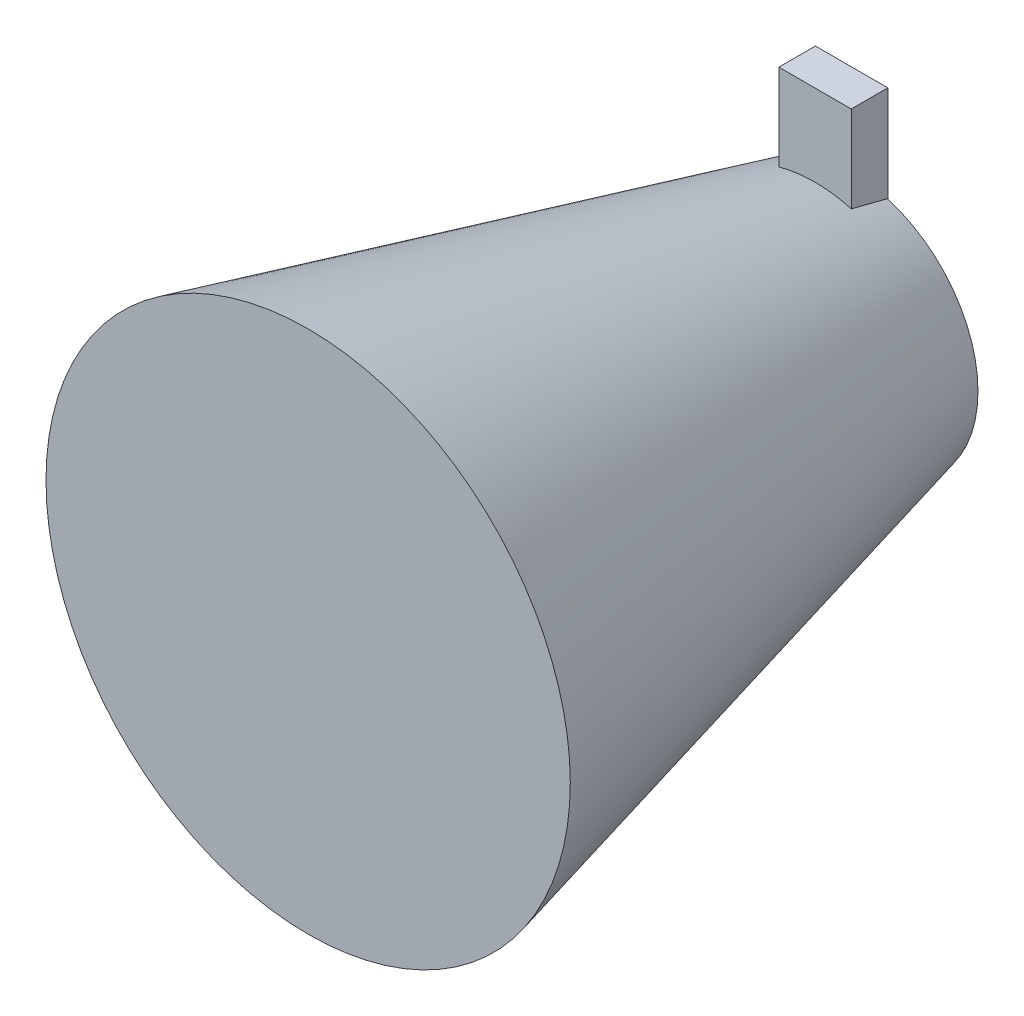
ISO-10303-21;
HEADER;
FILE_DESCRIPTION(('STEP AP214'),'2;1');
FILE_NAME('part.step','',(''),(''),'','','');
FILE_SCHEMA(('AUTOMOTIVE_DESIGN { 1 0 10303 214 1 1 1 1 }'));
ENDSEC;
DATA;
#1=APPLICATION_CONTEXT('core data for automotive mechanical design processes');
#2=APPLICATION_PROTOCOL_DEFINITION('international standard','automotive_design',2000,#1);
#3=PRODUCT_CONTEXT('',#1,'mechanical');
#4=PRODUCT('Part','Part','',(#3));
#5=PRODUCT_RELATED_PRODUCT_CATEGORY('part','',(#4));
#6=PRODUCT_DEFINITION_FORMATION('','',#4);
#7=PRODUCT_DEFINITION_CONTEXT('part definition',#1,'design');
#8=PRODUCT_DEFINITION('design','',#6,#7);
#9=PRODUCT_DEFINITION_SHAPE('','',#8);
#10=(LENGTH_UNIT() NAMED_UNIT(*) SI_UNIT(.MILLI.,.METRE.));
#11=(NAMED_UNIT(*) PLANE_ANGLE_UNIT() SI_UNIT($,.RADIAN.));
#12=(NAMED_UNIT(*) SI_UNIT($,.STERADIAN.) SOLID_ANGLE_UNIT());
#13=UNCERTAINTY_MEASURE_WITH_UNIT(LENGTH_MEASURE(1.E-05),#10,'distance_accuracy_value','');
#14=(GEOMETRIC_REPRESENTATION_CONTEXT(3) GLOBAL_UNCERTAINTY_ASSIGNED_CONTEXT((#13)) GLOBAL_UNIT_ASSIGNED_CONTEXT((#10,
#11,#12)) REPRESENTATION_CONTEXT('',''));
#15=CARTESIAN_POINT('',(0.,0.,0.));
#16=DIRECTION('',(0.,0.,1.));
#17=DIRECTION('',(1.,0.,0.));
#18=AXIS2_PLACEMENT_3D('',#15,#16,#17);
#19=CARTESIAN_POINT('',(-44.6455473550552,34.7888658367911,1.));
#20=DIRECTION('',(1.,0.,0.));
#21=DIRECTION('',(0.,0.,-1.));
#22=AXIS2_PLACEMENT_3D('',#19,#20,#21);
#23=PLANE('',#22);
#24=DIRECTION('',(0.,0.,-1.));
#25=VECTOR('',#24,1.);
#26=CARTESIAN_POINT('',(-44.6455473550552,34.7888658367911,1.));
#27=LINE('',#26,#25);
#28=CARTESIAN_POINT('',(-44.6455473550552,34.7888658367911,1.));
#29=VERTEX_POINT('',#28);
#30=CARTESIAN_POINT('',(-44.6455473550552,34.7888658367911,-0.01));
#31=VERTEX_POINT('',#30);
#32=EDGE_CURVE('E44',#29,#31,#27,.T.);
#33=ORIENTED_EDGE('',*,*,#32,.T.);
#34=DIRECTION('',(0.,-1.,0.));
#35=VECTOR('',#34,1.);
#36=CARTESIAN_POINT('',(-44.6455473550552,34.7888658367911,-0.01));
#37=LINE('',#36,#35);
#38=CARTESIAN_POINT('',(-44.6455473550552,40.7888658367911,-0.01));
#39=VERTEX_POINT('',#38);
#40=EDGE_CURVE('E81',#39,#31,#37,.T.);
#41=ORIENTED_EDGE('',*,*,#40,.F.);
#42=DIRECTION('',(0.,0.,-1.));
#43=VECTOR('',#42,1.);
#44=CARTESIAN_POINT('',(-44.6455473550552,40.7888658367911,1.));
#45=LINE('',#44,#43);
#46=CARTESIAN_POINT('',(-44.6455473550552,40.7888658367911,1.));
#47=VERTEX_POINT('',#46);
#48=EDGE_CURVE('E12',#47,#39,#45,.T.);
#49=ORIENTED_EDGE('',*,*,#48,.F.);
#50=DIRECTION('',(0.,-1.,0.));
#51=VECTOR('',#50,1.);
#52=CARTESIAN_POINT('',(-44.6455473550552,34.7888658367911,1.));
#53=LINE('',#52,#51);
#54=EDGE_CURVE('E82',#47,#29,#53,.T.);
#55=ORIENTED_EDGE('',*,*,#54,.T.);
#56=EDGE_LOOP('',(#33,#41,#49,#55));
#57=FACE_BOUND('',#56,.T.);
#58=ADVANCED_FACE('F41',(#57),#23,.T.);
#59=CARTESIAN_POINT('',(-44.6455473550552,40.7888658367911,1.));
#60=DIRECTION('',(0.,1.,0.));
#61=DIRECTION('',(0.,0.,1.));
#62=AXIS2_PLACEMENT_3D('',#59,#60,#61);
#63=PLANE('',#62);
#64=ORIENTED_EDGE('',*,*,#48,.T.);
#65=DIRECTION('',(1.,0.,0.));
#66=VECTOR('',#65,1.);
#67=CARTESIAN_POINT('',(-44.6455473550552,40.7888658367911,-0.01));
#68=LINE('',#67,#66);
#69=CARTESIAN_POINT('',(-46.6455473550552,40.7888658367911,-0.01));
#70=VERTEX_POINT('',#69);
#71=EDGE_CURVE('E98',#70,#39,#68,.T.);
#72=ORIENTED_EDGE('',*,*,#71,.F.);
#73=DIRECTION('',(0.,0.,-1.));
#74=VECTOR('',#73,1.);
#75=CARTESIAN_POINT('',(-46.6455473550552,40.7888658367911,1.));
#76=LINE('',#75,#74);
#77=CARTESIAN_POINT('',(-46.6455473550552,40.7888658367911,1.));
#78=VERTEX_POINT('',#77);
#79=EDGE_CURVE('E49',#78,#70,#76,.T.);
#80=ORIENTED_EDGE('',*,*,#79,.F.);
#81=DIRECTION('',(1.,0.,0.));
#82=VECTOR('',#81,1.);
#83=CARTESIAN_POINT('',(-44.6455473550552,40.7888658367911,1.));
#84=LINE('',#83,#82);
#85=EDGE_CURVE('E87',#78,#47,#84,.T.);
#86=ORIENTED_EDGE('',*,*,#85,.T.);
#87=EDGE_LOOP('',(#64,#72,#80,#86));
#88=FACE_BOUND('',#87,.T.);
#89=ADVANCED_FACE('F113',(#88),#63,.T.);
#90=CARTESIAN_POINT('',(-46.6455473550552,34.7888658367911,1.));
#91=DIRECTION('',(-1.,0.,0.));
#92=DIRECTION('',(0.,0.,1.));
#93=AXIS2_PLACEMENT_3D('',#90,#91,#92);
#94=PLANE('',#93);
#95=ORIENTED_EDGE('',*,*,#79,.T.);
#96=DIRECTION('',(0.,1.,0.));
#97=VECTOR('',#96,1.);
#98=CARTESIAN_POINT('',(-46.6455473550552,34.7888658367911,-0.01));
#99=LINE('',#98,#97);
#100=CARTESIAN_POINT('',(-46.6455473550552,34.7888658367911,-0.01));
#101=VERTEX_POINT('',#100);
#102=EDGE_CURVE('E94',#101,#70,#99,.T.);
#103=ORIENTED_EDGE('',*,*,#102,.F.);
#104=DIRECTION('',(0.,0.,-1.));
#105=VECTOR('',#104,1.);
#106=CARTESIAN_POINT('',(-46.6455473550552,34.7888658367911,1.));
#107=LINE('',#106,#105);
#108=CARTESIAN_POINT('',(-46.6455473550552,34.7888658367911,1.));
#109=VERTEX_POINT('',#108);
#110=EDGE_CURVE('E86',#109,#101,#107,.T.);
#111=ORIENTED_EDGE('',*,*,#110,.F.);
#112=DIRECTION('',(0.,1.,0.));
#113=VECTOR('',#112,1.);
#114=CARTESIAN_POINT('',(-46.6455473550552,34.7888658367911,1.));
#115=LINE('',#114,#113);
#116=EDGE_CURVE('E106',#109,#78,#115,.T.);
#117=ORIENTED_EDGE('',*,*,#116,.T.);
#118=EDGE_LOOP('',(#95,#103,#111,#117));
#119=FACE_BOUND('',#118,.T.);
#120=ADVANCED_FACE('F110',(#119),#94,.T.);
#121=CARTESIAN_POINT('',(-44.6455473550552,34.7888658367911,1.));
#122=DIRECTION('',(0.,-1.,0.));
#123=DIRECTION('',(0.,0.,-1.));
#124=AXIS2_PLACEMENT_3D('',#121,#122,#123);
#125=PLANE('',#124);
#126=ORIENTED_EDGE('',*,*,#110,.T.);
#127=DIRECTION('',(-1.,0.,0.));
#128=VECTOR('',#127,1.);
#129=CARTESIAN_POINT('',(-44.6455473550552,34.7888658367911,-0.01));
#130=LINE('',#129,#128);
#131=EDGE_CURVE('E89',#31,#101,#130,.T.);
#132=ORIENTED_EDGE('',*,*,#131,.F.);
#133=ORIENTED_EDGE('',*,*,#32,.F.);
#134=DIRECTION('',(-1.,0.,0.));
#135=VECTOR('',#134,1.);
#136=CARTESIAN_POINT('',(-44.6455473550552,34.7888658367911,1.));
#137=LINE('',#136,#135);
#138=EDGE_CURVE('E104',#29,#109,#137,.T.);
#139=ORIENTED_EDGE('',*,*,#138,.T.);
#140=EDGE_LOOP('',(#126,#132,#133,#139));
#141=FACE_BOUND('',#140,.T.);
#142=ADVANCED_FACE('F90',(#141),#125,.T.);
#143=CARTESIAN_POINT('',(0.,0.,1.));
#144=DIRECTION('',(0.,0.,1.));
#145=DIRECTION('',(1.,0.,0.));
#146=AXIS2_PLACEMENT_3D('',#143,#144,#145);
#147=PLANE('',#146);
#148=ORIENTED_EDGE('',*,*,#54,.F.);
#149=ORIENTED_EDGE('',*,*,#85,.F.);
#150=ORIENTED_EDGE('',*,*,#116,.F.);
#151=ORIENTED_EDGE('',*,*,#138,.F.);
#152=EDGE_LOOP('',(#148,#149,#150,#151));
#153=FACE_BOUND('',#152,.T.);
#154=ADVANCED_FACE('F115',(#153),#147,.T.);
#155=CARTESIAN_POINT('',(0.,0.,-0.01));
#156=DIRECTION('',(0.,0.,1.));
#157=DIRECTION('',(1.,0.,0.));
#158=AXIS2_PLACEMENT_3D('',#155,#156,#157);
#159=PLANE('',#158);
#160=ORIENTED_EDGE('',*,*,#40,.T.);
#161=ORIENTED_EDGE('',*,*,#131,.T.);
#162=ORIENTED_EDGE('',*,*,#102,.T.);
#163=ORIENTED_EDGE('',*,*,#71,.T.);
#164=EDGE_LOOP('',(#160,#161,#162,#163));
#165=FACE_BOUND('',#164,.T.);
#166=ADVANCED_FACE('F97',(#165),#159,.F.);
#167=CLOSED_SHELL('',(#58,#89,#120,#142,#154,#166));
#168=MANIFOLD_SOLID_BREP('B2',#167);
#169=CARTESIAN_POINT('',(-45.6455473550552,34.7888658367911,0.));
#170=DIRECTION('',(0.,0.,1.));
#171=DIRECTION('',(1.,0.,0.));
#172=AXIS2_PLACEMENT_3D('',#169,#170,#171);
#173=CONICAL_SURFACE('',#172,3.5,0.244346095279206);
#174=CARTESIAN_POINT('',(-45.6455473550552,34.7888658367911,15.));
#175=DIRECTION('',(0.,0.,1.));
#176=DIRECTION('',(1.,0.,0.));
#177=AXIS2_PLACEMENT_3D('',#174,#175,#176);
#178=CIRCLE('',#177,7.23992004264771);
#179=CARTESIAN_POINT('',(-38.4056273124075,34.7888658367911,15.));
#180=VERTEX_POINT('',#179);
#181=EDGE_CURVE('E40',#180,#180,#178,.T.);
#182=ORIENTED_EDGE('',*,*,#181,.F.);
#183=EDGE_LOOP('',(#182));
#184=FACE_BOUND('',#183,.T.);
#185=CARTESIAN_POINT('',(-45.6455473550552,34.7888658367911,0.));
#186=DIRECTION('',(0.,0.,1.));
#187=DIRECTION('',(1.,0.,0.));
#188=AXIS2_PLACEMENT_3D('',#185,#186,#187);
#189=CIRCLE('',#188,3.5);
#190=CARTESIAN_POINT('',(-42.1455473550552,34.7888658367911,0.));
#191=VERTEX_POINT('',#190);
#192=EDGE_CURVE('E171',#191,#191,#189,.T.);
#193=ORIENTED_EDGE('',*,*,#192,.T.);
#194=EDGE_LOOP('',(#193));
#195=FACE_BOUND('',#194,.T.);
#196=ADVANCED_FACE('F165',(#184,#195),#173,.T.);
#197=CARTESIAN_POINT('',(-45.6455473550552,34.7888658367911,15.));
#198=DIRECTION('',(0.,0.,1.));
#199=DIRECTION('',(1.,0.,0.));
#200=AXIS2_PLACEMENT_3D('',#197,#198,#199);
#201=PLANE('',#200);
#202=ORIENTED_EDGE('',*,*,#181,.T.);
#203=EDGE_LOOP('',(#202));
#204=FACE_BOUND('',#203,.T.);
#205=ADVANCED_FACE('F180',(#204),#201,.T.);
#206=CARTESIAN_POINT('',(-45.6455473550552,34.7888658367911,0.));
#207=DIRECTION('',(0.,0.,1.));
#208=DIRECTION('',(1.,0.,0.));
#209=AXIS2_PLACEMENT_3D('',#206,#207,#208);
#210=PLANE('',#209);
#211=ORIENTED_EDGE('',*,*,#192,.F.);
#212=EDGE_LOOP('',(#211));
#213=FACE_BOUND('',#212,.T.);
#214=ADVANCED_FACE('F178',(#213),#210,.F.);
#215=CLOSED_SHELL('',(#196,#205,#214));
#216=MANIFOLD_SOLID_BREP('B6',#215);
#217=ADVANCED_BREP_SHAPE_REPRESENTATION('',(#18,#168,#216),#14);
#218=SHAPE_DEFINITION_REPRESENTATION(#9,#217);
ENDSEC;
END-ISO-10303-21;
